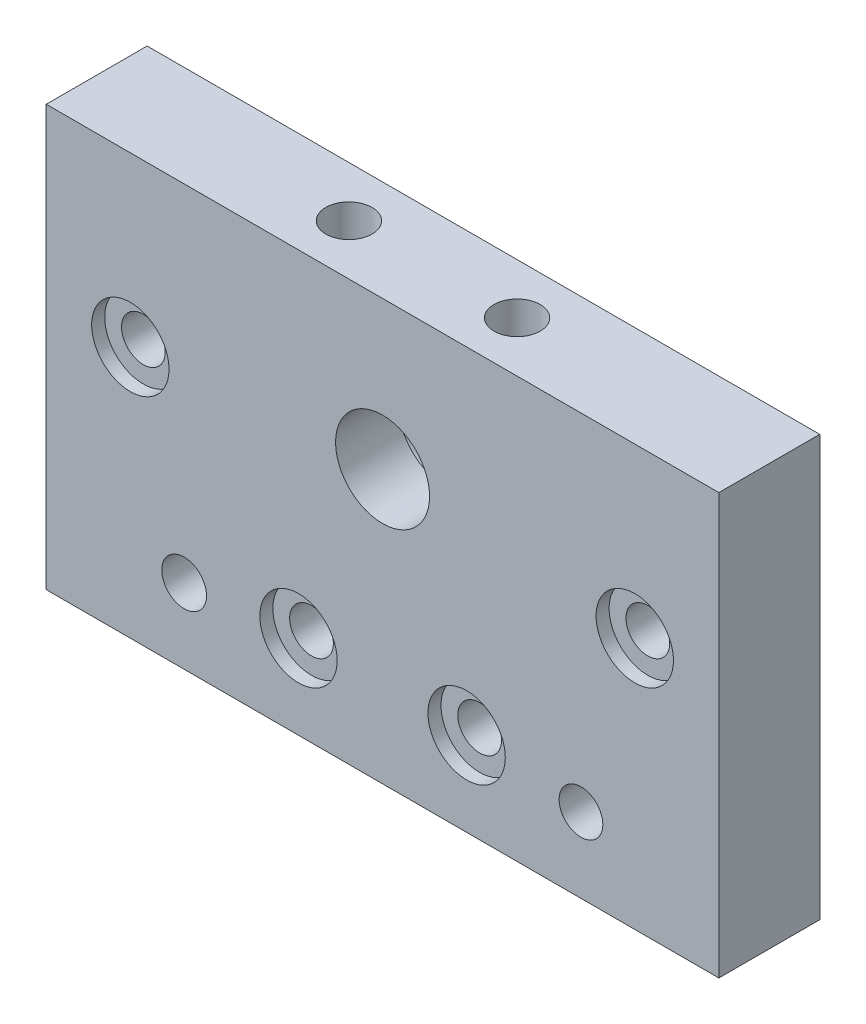
ISO-10303-21;
HEADER;
FILE_DESCRIPTION(('STEP AP214'),'2;1');
FILE_NAME('part.step','',(''),(''),'','','');
FILE_SCHEMA(('AUTOMOTIVE_DESIGN { 1 0 10303 214 1 1 1 1 }'));
ENDSEC;
DATA;
#1=APPLICATION_CONTEXT('core data for automotive mechanical design processes');
#2=APPLICATION_PROTOCOL_DEFINITION('international standard','automotive_design',2000,#1);
#3=PRODUCT_CONTEXT('',#1,'mechanical');
#4=PRODUCT('Part','Part','',(#3));
#5=PRODUCT_RELATED_PRODUCT_CATEGORY('part','',(#4));
#6=PRODUCT_DEFINITION_FORMATION('','',#4);
#7=PRODUCT_DEFINITION_CONTEXT('part definition',#1,'design');
#8=PRODUCT_DEFINITION('design','',#6,#7);
#9=PRODUCT_DEFINITION_SHAPE('','',#8);
#10=(LENGTH_UNIT() NAMED_UNIT(*) SI_UNIT(.MILLI.,.METRE.));
#11=(NAMED_UNIT(*) PLANE_ANGLE_UNIT() SI_UNIT($,.RADIAN.));
#12=(NAMED_UNIT(*) SI_UNIT($,.STERADIAN.) SOLID_ANGLE_UNIT());
#13=UNCERTAINTY_MEASURE_WITH_UNIT(LENGTH_MEASURE(1.E-05),#10,'distance_accuracy_value','');
#14=(GEOMETRIC_REPRESENTATION_CONTEXT(3) GLOBAL_UNCERTAINTY_ASSIGNED_CONTEXT((#13)) GLOBAL_UNIT_ASSIGNED_CONTEXT((#10,
#11,#12)) REPRESENTATION_CONTEXT('',''));
#15=CARTESIAN_POINT('',(0.,0.,0.));
#16=DIRECTION('',(0.,0.,1.));
#17=DIRECTION('',(1.,0.,0.));
#18=AXIS2_PLACEMENT_3D('',#15,#16,#17);
#19=CARTESIAN_POINT('',(40.,32.4,12.));
#20=DIRECTION('',(0.,0.,-1.));
#21=DIRECTION('',(-1.,0.,0.));
#22=AXIS2_PLACEMENT_3D('',#19,#20,#21);
#23=CYLINDRICAL_SURFACE('',#22,5.59);
#24=CARTESIAN_POINT('',(40.,32.4,12.));
#25=DIRECTION('',(0.,0.,1.));
#26=DIRECTION('',(1.,0.,0.));
#27=AXIS2_PLACEMENT_3D('',#24,#25,#26);
#28=CIRCLE('',#27,5.59);
#29=CARTESIAN_POINT('',(45.59,32.4,12.));
#30=VERTEX_POINT('',#29);
#31=EDGE_CURVE('E187',#30,#30,#28,.T.);
#32=ORIENTED_EDGE('',*,*,#31,.T.);
#33=EDGE_LOOP('',(#32));
#34=FACE_BOUND('',#33,.T.);
#35=CARTESIAN_POINT('',(40.,32.4,4.5));
#36=DIRECTION('',(0.,0.,-1.));
#37=DIRECTION('',(-1.,0.,0.));
#38=AXIS2_PLACEMENT_3D('',#35,#36,#37);
#39=CIRCLE('',#38,5.59);
#40=CARTESIAN_POINT('',(34.41,32.4,4.5));
#41=VERTEX_POINT('',#40);
#42=EDGE_CURVE('E44',#41,#41,#39,.T.);
#43=ORIENTED_EDGE('',*,*,#42,.T.);
#44=EDGE_LOOP('',(#43));
#45=FACE_BOUND('',#44,.T.);
#46=ADVANCED_FACE('F40',(#34,#45),#23,.F.);
#47=CARTESIAN_POINT('',(10.,30.,12.));
#48=DIRECTION('',(0.,0.,-1.));
#49=DIRECTION('',(-1.,0.,0.));
#50=AXIS2_PLACEMENT_3D('',#47,#48,#49);
#51=CYLINDRICAL_SURFACE('',#50,2.6);
#52=CARTESIAN_POINT('',(10.,30.,0.));
#53=DIRECTION('',(0.,0.,1.));
#54=DIRECTION('',(1.,0.,0.));
#55=AXIS2_PLACEMENT_3D('',#52,#53,#54);
#56=CIRCLE('',#55,2.6);
#57=CARTESIAN_POINT('',(12.6,30.,0.));
#58=VERTEX_POINT('',#57);
#59=EDGE_CURVE('E198',#58,#58,#56,.T.);
#60=ORIENTED_EDGE('',*,*,#59,.F.);
#61=EDGE_LOOP('',(#60));
#62=FACE_BOUND('',#61,.T.);
#63=CARTESIAN_POINT('',(10.,30.,10.45));
#64=DIRECTION('',(0.,0.,1.));
#65=DIRECTION('',(1.,0.,0.));
#66=AXIS2_PLACEMENT_3D('',#63,#64,#65);
#67=CIRCLE('',#66,2.6);
#68=CARTESIAN_POINT('',(12.6,30.,10.45));
#69=VERTEX_POINT('',#68);
#70=EDGE_CURVE('E174',#69,#69,#67,.T.);
#71=ORIENTED_EDGE('',*,*,#70,.T.);
#72=EDGE_LOOP('',(#71));
#73=FACE_BOUND('',#72,.T.);
#74=ADVANCED_FACE('F244',(#62,#73),#51,.F.);
#75=CARTESIAN_POINT('',(70.,30.,12.));
#76=DIRECTION('',(0.,0.,-1.));
#77=DIRECTION('',(-1.,0.,0.));
#78=AXIS2_PLACEMENT_3D('',#75,#76,#77);
#79=CYLINDRICAL_SURFACE('',#78,2.6);
#80=CARTESIAN_POINT('',(70.,30.,0.));
#81=DIRECTION('',(0.,0.,1.));
#82=DIRECTION('',(1.,0.,0.));
#83=AXIS2_PLACEMENT_3D('',#80,#81,#82);
#84=CIRCLE('',#83,2.6);
#85=CARTESIAN_POINT('',(72.6,30.,0.));
#86=VERTEX_POINT('',#85);
#87=EDGE_CURVE('E194',#86,#86,#84,.T.);
#88=ORIENTED_EDGE('',*,*,#87,.F.);
#89=EDGE_LOOP('',(#88));
#90=FACE_BOUND('',#89,.T.);
#91=CARTESIAN_POINT('',(70.,30.,10.45));
#92=DIRECTION('',(0.,0.,1.));
#93=DIRECTION('',(1.,0.,0.));
#94=AXIS2_PLACEMENT_3D('',#91,#92,#93);
#95=CIRCLE('',#94,2.6);
#96=CARTESIAN_POINT('',(72.6,30.,10.45));
#97=VERTEX_POINT('',#96);
#98=EDGE_CURVE('E237',#97,#97,#95,.T.);
#99=ORIENTED_EDGE('',*,*,#98,.T.);
#100=EDGE_LOOP('',(#99));
#101=FACE_BOUND('',#100,.T.);
#102=ADVANCED_FACE('F305',(#90,#101),#79,.F.);
#103=CARTESIAN_POINT('',(30.,10.,12.));
#104=DIRECTION('',(0.,0.,-1.));
#105=DIRECTION('',(-1.,0.,0.));
#106=AXIS2_PLACEMENT_3D('',#103,#104,#105);
#107=CYLINDRICAL_SURFACE('',#106,2.6);
#108=CARTESIAN_POINT('',(30.,10.,0.));
#109=DIRECTION('',(0.,0.,1.));
#110=DIRECTION('',(1.,0.,0.));
#111=AXIS2_PLACEMENT_3D('',#108,#109,#110);
#112=CIRCLE('',#111,2.6);
#113=CARTESIAN_POINT('',(32.6,10.,0.));
#114=VERTEX_POINT('',#113);
#115=EDGE_CURVE('E178',#114,#114,#112,.T.);
#116=ORIENTED_EDGE('',*,*,#115,.F.);
#117=EDGE_LOOP('',(#116));
#118=FACE_BOUND('',#117,.T.);
#119=CARTESIAN_POINT('',(30.,10.,10.45));
#120=DIRECTION('',(0.,0.,1.));
#121=DIRECTION('',(1.,0.,0.));
#122=AXIS2_PLACEMENT_3D('',#119,#120,#121);
#123=CIRCLE('',#122,2.6);
#124=CARTESIAN_POINT('',(32.6,10.,10.45));
#125=VERTEX_POINT('',#124);
#126=EDGE_CURVE('E233',#125,#125,#123,.T.);
#127=ORIENTED_EDGE('',*,*,#126,.T.);
#128=EDGE_LOOP('',(#127));
#129=FACE_BOUND('',#128,.T.);
#130=ADVANCED_FACE('F313',(#118,#129),#107,.F.);
#131=CARTESIAN_POINT('',(50.,10.,12.));
#132=DIRECTION('',(0.,0.,-1.));
#133=DIRECTION('',(-1.,0.,0.));
#134=AXIS2_PLACEMENT_3D('',#131,#132,#133);
#135=CYLINDRICAL_SURFACE('',#134,2.6);
#136=CARTESIAN_POINT('',(50.,10.,0.));
#137=DIRECTION('',(0.,0.,1.));
#138=DIRECTION('',(1.,0.,0.));
#139=AXIS2_PLACEMENT_3D('',#136,#137,#138);
#140=CIRCLE('',#139,2.6);
#141=CARTESIAN_POINT('',(52.6,10.,0.));
#142=VERTEX_POINT('',#141);
#143=EDGE_CURVE('E169',#142,#142,#140,.T.);
#144=ORIENTED_EDGE('',*,*,#143,.F.);
#145=EDGE_LOOP('',(#144));
#146=FACE_BOUND('',#145,.T.);
#147=CARTESIAN_POINT('',(50.,10.,10.45));
#148=DIRECTION('',(0.,0.,1.));
#149=DIRECTION('',(1.,0.,0.));
#150=AXIS2_PLACEMENT_3D('',#147,#148,#149);
#151=CIRCLE('',#150,2.6);
#152=CARTESIAN_POINT('',(52.6,10.,10.45));
#153=VERTEX_POINT('',#152);
#154=EDGE_CURVE('E136',#153,#153,#151,.T.);
#155=ORIENTED_EDGE('',*,*,#154,.T.);
#156=EDGE_LOOP('',(#155));
#157=FACE_BOUND('',#156,.T.);
#158=ADVANCED_FACE('F264',(#146,#157),#135,.F.);
#159=CARTESIAN_POINT('',(0.,0.,12.));
#160=DIRECTION('',(0.,0.,-1.));
#161=DIRECTION('',(-1.,0.,0.));
#162=AXIS2_PLACEMENT_3D('',#159,#160,#161);
#163=PLANE('',#162);
#164=CARTESIAN_POINT('',(10.,30.,12.));
#165=DIRECTION('',(0.,0.,1.));
#166=DIRECTION('',(1.,0.,0.));
#167=AXIS2_PLACEMENT_3D('',#164,#165,#166);
#168=CIRCLE('',#167,4.6);
#169=CARTESIAN_POINT('',(14.6,30.,12.));
#170=VERTEX_POINT('',#169);
#171=EDGE_CURVE('E137',#170,#170,#168,.T.);
#172=ORIENTED_EDGE('',*,*,#171,.F.);
#173=EDGE_LOOP('',(#172));
#174=FACE_BOUND('',#173,.T.);
#175=CARTESIAN_POINT('',(50.,10.,12.));
#176=DIRECTION('',(0.,0.,1.));
#177=DIRECTION('',(1.,0.,0.));
#178=AXIS2_PLACEMENT_3D('',#175,#176,#177);
#179=CIRCLE('',#178,4.6);
#180=CARTESIAN_POINT('',(54.6,10.,12.));
#181=VERTEX_POINT('',#180);
#182=EDGE_CURVE('E147',#181,#181,#179,.T.);
#183=ORIENTED_EDGE('',*,*,#182,.F.);
#184=EDGE_LOOP('',(#183));
#185=FACE_BOUND('',#184,.T.);
#186=CARTESIAN_POINT('',(30.,10.,12.));
#187=DIRECTION('',(0.,0.,1.));
#188=DIRECTION('',(1.,0.,0.));
#189=AXIS2_PLACEMENT_3D('',#186,#187,#188);
#190=CIRCLE('',#189,4.6);
#191=CARTESIAN_POINT('',(34.6,10.,12.));
#192=VERTEX_POINT('',#191);
#193=EDGE_CURVE('E146',#192,#192,#190,.T.);
#194=ORIENTED_EDGE('',*,*,#193,.F.);
#195=EDGE_LOOP('',(#194));
#196=FACE_BOUND('',#195,.T.);
#197=CARTESIAN_POINT('',(70.,30.,12.));
#198=DIRECTION('',(0.,0.,1.));
#199=DIRECTION('',(1.,0.,0.));
#200=AXIS2_PLACEMENT_3D('',#197,#198,#199);
#201=CIRCLE('',#200,4.6);
#202=CARTESIAN_POINT('',(74.6,30.,12.));
#203=VERTEX_POINT('',#202);
#204=EDGE_CURVE('E154',#203,#203,#201,.T.);
#205=ORIENTED_EDGE('',*,*,#204,.F.);
#206=EDGE_LOOP('',(#205));
#207=FACE_BOUND('',#206,.T.);
#208=DIRECTION('',(0.,-1.,0.));
#209=VECTOR('',#208,1.);
#210=CARTESIAN_POINT('',(0.,0.,12.));
#211=LINE('',#210,#209);
#212=CARTESIAN_POINT('',(0.,50.,12.));
#213=VERTEX_POINT('',#212);
#214=CARTESIAN_POINT('',(0.,0.,12.));
#215=VERTEX_POINT('',#214);
#216=EDGE_CURVE('E203',#213,#215,#211,.T.);
#217=ORIENTED_EDGE('',*,*,#216,.T.);
#218=DIRECTION('',(1.,0.,0.));
#219=VECTOR('',#218,1.);
#220=CARTESIAN_POINT('',(0.,0.,12.));
#221=LINE('',#220,#219);
#222=CARTESIAN_POINT('',(80.,0.,12.));
#223=VERTEX_POINT('',#222);
#224=EDGE_CURVE('E91',#215,#223,#221,.T.);
#225=ORIENTED_EDGE('',*,*,#224,.T.);
#226=DIRECTION('',(0.,1.,0.));
#227=VECTOR('',#226,1.);
#228=CARTESIAN_POINT('',(80.,50.,12.));
#229=LINE('',#228,#227);
#230=CARTESIAN_POINT('',(80.,50.,12.));
#231=VERTEX_POINT('',#230);
#232=EDGE_CURVE('E208',#223,#231,#229,.T.);
#233=ORIENTED_EDGE('',*,*,#232,.T.);
#234=DIRECTION('',(-1.,0.,0.));
#235=VECTOR('',#234,1.);
#236=CARTESIAN_POINT('',(0.,50.,12.));
#237=LINE('',#236,#235);
#238=EDGE_CURVE('E60',#231,#213,#237,.T.);
#239=ORIENTED_EDGE('',*,*,#238,.T.);
#240=EDGE_LOOP('',(#217,#225,#233,#239));
#241=FACE_BOUND('',#240,.T.);
#242=ORIENTED_EDGE('',*,*,#31,.F.);
#243=EDGE_LOOP('',(#242));
#244=FACE_BOUND('',#243,.T.);
#245=CARTESIAN_POINT('',(16.4,8.9,12.));
#246=DIRECTION('',(0.,0.,1.));
#247=DIRECTION('',(1.,0.,0.));
#248=AXIS2_PLACEMENT_3D('',#245,#246,#247);
#249=CIRCLE('',#248,2.66170371125502);
#250=CARTESIAN_POINT('',(19.061703711255,8.9,12.));
#251=VERTEX_POINT('',#250);
#252=EDGE_CURVE('E183',#251,#251,#249,.T.);
#253=ORIENTED_EDGE('',*,*,#252,.F.);
#254=EDGE_LOOP('',(#253));
#255=FACE_BOUND('',#254,.T.);
#256=CARTESIAN_POINT('',(63.6,8.9,12.));
#257=DIRECTION('',(0.,0.,1.));
#258=DIRECTION('',(1.,0.,0.));
#259=AXIS2_PLACEMENT_3D('',#256,#257,#258);
#260=CIRCLE('',#259,2.6);
#261=CARTESIAN_POINT('',(66.2,8.9,12.));
#262=VERTEX_POINT('',#261);
#263=EDGE_CURVE('E165',#262,#262,#260,.T.);
#264=ORIENTED_EDGE('',*,*,#263,.F.);
#265=EDGE_LOOP('',(#264));
#266=FACE_BOUND('',#265,.T.);
#267=ADVANCED_FACE('F260',(#174,#185,#196,#207,#241,#244,#255,#266),#163,.F.);
#268=CARTESIAN_POINT('',(0.,0.,0.));
#269=DIRECTION('',(0.,0.,-1.));
#270=DIRECTION('',(-1.,0.,0.));
#271=AXIS2_PLACEMENT_3D('',#268,#269,#270);
#272=PLANE('',#271);
#273=CARTESIAN_POINT('',(40.,32.4,0.));
#274=DIRECTION('',(0.,0.,-1.));
#275=DIRECTION('',(-1.,0.,0.));
#276=AXIS2_PLACEMENT_3D('',#273,#274,#275);
#277=CIRCLE('',#276,8.05);
#278=CARTESIAN_POINT('',(31.95,32.4,0.));
#279=VERTEX_POINT('',#278);
#280=EDGE_CURVE('E124',#279,#279,#277,.T.);
#281=ORIENTED_EDGE('',*,*,#280,.F.);
#282=EDGE_LOOP('',(#281));
#283=FACE_BOUND('',#282,.T.);
#284=ORIENTED_EDGE('',*,*,#143,.T.);
#285=EDGE_LOOP('',(#284));
#286=FACE_BOUND('',#285,.T.);
#287=CARTESIAN_POINT('',(16.4,8.9,0.));
#288=DIRECTION('',(0.,0.,1.));
#289=DIRECTION('',(1.,0.,0.));
#290=AXIS2_PLACEMENT_3D('',#287,#288,#289);
#291=CIRCLE('',#290,2.66170371125502);
#292=CARTESIAN_POINT('',(19.061703711255,8.9,0.));
#293=VERTEX_POINT('',#292);
#294=EDGE_CURVE('E182',#293,#293,#291,.T.);
#295=ORIENTED_EDGE('',*,*,#294,.T.);
#296=EDGE_LOOP('',(#295));
#297=FACE_BOUND('',#296,.T.);
#298=ORIENTED_EDGE('',*,*,#87,.T.);
#299=EDGE_LOOP('',(#298));
#300=FACE_BOUND('',#299,.T.);
#301=DIRECTION('',(0.,-1.,0.));
#302=VECTOR('',#301,1.);
#303=CARTESIAN_POINT('',(0.,0.,0.));
#304=LINE('',#303,#302);
#305=CARTESIAN_POINT('',(0.,50.,0.));
#306=VERTEX_POINT('',#305);
#307=CARTESIAN_POINT('',(0.,0.,0.));
#308=VERTEX_POINT('',#307);
#309=EDGE_CURVE('E202',#306,#308,#304,.T.);
#310=ORIENTED_EDGE('',*,*,#309,.F.);
#311=DIRECTION('',(-1.,0.,0.));
#312=VECTOR('',#311,1.);
#313=CARTESIAN_POINT('',(0.,50.,0.));
#314=LINE('',#313,#312);
#315=CARTESIAN_POINT('',(80.,50.,0.));
#316=VERTEX_POINT('',#315);
#317=EDGE_CURVE('E84',#316,#306,#314,.T.);
#318=ORIENTED_EDGE('',*,*,#317,.F.);
#319=DIRECTION('',(0.,1.,0.));
#320=VECTOR('',#319,1.);
#321=CARTESIAN_POINT('',(80.,50.,0.));
#322=LINE('',#321,#320);
#323=CARTESIAN_POINT('',(80.,0.,0.));
#324=VERTEX_POINT('',#323);
#325=EDGE_CURVE('E78',#324,#316,#322,.T.);
#326=ORIENTED_EDGE('',*,*,#325,.F.);
#327=DIRECTION('',(1.,0.,0.));
#328=VECTOR('',#327,1.);
#329=CARTESIAN_POINT('',(0.,0.,0.));
#330=LINE('',#329,#328);
#331=EDGE_CURVE('E217',#308,#324,#330,.T.);
#332=ORIENTED_EDGE('',*,*,#331,.F.);
#333=EDGE_LOOP('',(#310,#318,#326,#332));
#334=FACE_BOUND('',#333,.T.);
#335=ORIENTED_EDGE('',*,*,#59,.T.);
#336=EDGE_LOOP('',(#335));
#337=FACE_BOUND('',#336,.T.);
#338=ORIENTED_EDGE('',*,*,#115,.T.);
#339=EDGE_LOOP('',(#338));
#340=FACE_BOUND('',#339,.T.);
#341=CARTESIAN_POINT('',(63.6,8.9,0.));
#342=DIRECTION('',(0.,0.,1.));
#343=DIRECTION('',(1.,0.,0.));
#344=AXIS2_PLACEMENT_3D('',#341,#342,#343);
#345=CIRCLE('',#344,2.6);
#346=CARTESIAN_POINT('',(66.2,8.9,0.));
#347=VERTEX_POINT('',#346);
#348=EDGE_CURVE('E170',#347,#347,#345,.T.);
#349=ORIENTED_EDGE('',*,*,#348,.T.);
#350=EDGE_LOOP('',(#349));
#351=FACE_BOUND('',#350,.T.);
#352=ADVANCED_FACE('F263',(#283,#286,#297,#300,#334,#337,#340,#351),#272,.T.);
#353=CARTESIAN_POINT('',(0.,0.,12.));
#354=DIRECTION('',(1.,0.,0.));
#355=DIRECTION('',(0.,0.,-1.));
#356=AXIS2_PLACEMENT_3D('',#353,#354,#355);
#357=PLANE('',#356);
#358=ORIENTED_EDGE('',*,*,#309,.T.);
#359=DIRECTION('',(0.,0.,-1.));
#360=VECTOR('',#359,1.);
#361=CARTESIAN_POINT('',(0.,0.,12.));
#362=LINE('',#361,#360);
#363=EDGE_CURVE('E11',#215,#308,#362,.T.);
#364=ORIENTED_EDGE('',*,*,#363,.F.);
#365=ORIENTED_EDGE('',*,*,#216,.F.);
#366=DIRECTION('',(0.,0.,-1.));
#367=VECTOR('',#366,1.);
#368=CARTESIAN_POINT('',(0.,50.,12.));
#369=LINE('',#368,#367);
#370=EDGE_CURVE('E213',#213,#306,#369,.T.);
#371=ORIENTED_EDGE('',*,*,#370,.T.);
#372=EDGE_LOOP('',(#358,#364,#365,#371));
#373=FACE_BOUND('',#372,.T.);
#374=ADVANCED_FACE('F42',(#373),#357,.F.);
#375=CARTESIAN_POINT('',(0.,0.,12.));
#376=DIRECTION('',(0.,1.,0.));
#377=DIRECTION('',(0.,0.,1.));
#378=AXIS2_PLACEMENT_3D('',#375,#376,#377);
#379=PLANE('',#378);
#380=ORIENTED_EDGE('',*,*,#331,.T.);
#381=DIRECTION('',(0.,0.,-1.));
#382=VECTOR('',#381,1.);
#383=CARTESIAN_POINT('',(80.,0.,12.));
#384=LINE('',#383,#382);
#385=EDGE_CURVE('E51',#223,#324,#384,.T.);
#386=ORIENTED_EDGE('',*,*,#385,.F.);
#387=ORIENTED_EDGE('',*,*,#224,.F.);
#388=ORIENTED_EDGE('',*,*,#363,.T.);
#389=EDGE_LOOP('',(#380,#386,#387,#388));
#390=FACE_BOUND('',#389,.T.);
#391=ADVANCED_FACE('F294',(#390),#379,.F.);
#392=CARTESIAN_POINT('',(80.,50.,12.));
#393=DIRECTION('',(-1.,0.,0.));
#394=DIRECTION('',(0.,0.,1.));
#395=AXIS2_PLACEMENT_3D('',#392,#393,#394);
#396=PLANE('',#395);
#397=ORIENTED_EDGE('',*,*,#325,.T.);
#398=DIRECTION('',(0.,0.,-1.));
#399=VECTOR('',#398,1.);
#400=CARTESIAN_POINT('',(80.,50.,12.));
#401=LINE('',#400,#399);
#402=EDGE_CURVE('E226',#231,#316,#401,.T.);
#403=ORIENTED_EDGE('',*,*,#402,.F.);
#404=ORIENTED_EDGE('',*,*,#232,.F.);
#405=ORIENTED_EDGE('',*,*,#385,.T.);
#406=EDGE_LOOP('',(#397,#403,#404,#405));
#407=FACE_BOUND('',#406,.T.);
#408=ADVANCED_FACE('F386',(#407),#396,.F.);
#409=CARTESIAN_POINT('',(0.,50.,12.));
#410=DIRECTION('',(0.,-1.,0.));
#411=DIRECTION('',(0.,0.,-1.));
#412=AXIS2_PLACEMENT_3D('',#409,#410,#411);
#413=PLANE('',#412);
#414=CARTESIAN_POINT('',(50.,50.,6.));
#415=DIRECTION('',(0.,1.,0.));
#416=DIRECTION('',(0.,0.,1.));
#417=AXIS2_PLACEMENT_3D('',#414,#415,#416);
#418=CIRCLE('',#417,2.75);
#419=CARTESIAN_POINT('',(50.,50.,8.75));
#420=VERTEX_POINT('',#419);
#421=EDGE_CURVE('E110',#420,#420,#418,.T.);
#422=ORIENTED_EDGE('',*,*,#421,.F.);
#423=EDGE_LOOP('',(#422));
#424=FACE_BOUND('',#423,.T.);
#425=CARTESIAN_POINT('',(30.,50.,6.));
#426=DIRECTION('',(0.,1.,0.));
#427=DIRECTION('',(0.,0.,1.));
#428=AXIS2_PLACEMENT_3D('',#425,#426,#427);
#429=CIRCLE('',#428,2.74999999999999);
#430=CARTESIAN_POINT('',(30.,50.,8.74999999999999));
#431=VERTEX_POINT('',#430);
#432=EDGE_CURVE('E109',#431,#431,#429,.T.);
#433=ORIENTED_EDGE('',*,*,#432,.F.);
#434=EDGE_LOOP('',(#433));
#435=FACE_BOUND('',#434,.T.);
#436=ORIENTED_EDGE('',*,*,#317,.T.);
#437=ORIENTED_EDGE('',*,*,#370,.F.);
#438=ORIENTED_EDGE('',*,*,#238,.F.);
#439=ORIENTED_EDGE('',*,*,#402,.T.);
#440=EDGE_LOOP('',(#436,#437,#438,#439));
#441=FACE_BOUND('',#440,.T.);
#442=ADVANCED_FACE('F383',(#424,#435,#441),#413,.F.);
#443=CARTESIAN_POINT('',(16.4,8.9,12.));
#444=DIRECTION('',(0.,0.,-1.));
#445=DIRECTION('',(-1.,0.,0.));
#446=AXIS2_PLACEMENT_3D('',#443,#444,#445);
#447=CYLINDRICAL_SURFACE('',#446,2.66170371125502);
#448=ORIENTED_EDGE('',*,*,#252,.T.);
#449=EDGE_LOOP('',(#448));
#450=FACE_BOUND('',#449,.T.);
#451=ORIENTED_EDGE('',*,*,#294,.F.);
#452=EDGE_LOOP('',(#451));
#453=FACE_BOUND('',#452,.T.);
#454=ADVANCED_FACE('F284',(#450,#453),#447,.F.);
#455=CARTESIAN_POINT('',(63.6,8.9,12.));
#456=DIRECTION('',(0.,0.,-1.));
#457=DIRECTION('',(-1.,0.,0.));
#458=AXIS2_PLACEMENT_3D('',#455,#456,#457);
#459=CYLINDRICAL_SURFACE('',#458,2.6);
#460=ORIENTED_EDGE('',*,*,#263,.T.);
#461=EDGE_LOOP('',(#460));
#462=FACE_BOUND('',#461,.T.);
#463=ORIENTED_EDGE('',*,*,#348,.F.);
#464=EDGE_LOOP('',(#463));
#465=FACE_BOUND('',#464,.T.);
#466=ADVANCED_FACE('F280',(#462,#465),#459,.F.);
#467=CARTESIAN_POINT('',(50.,10.,10.45));
#468=DIRECTION('',(0.,0.,1.));
#469=DIRECTION('',(1.,0.,0.));
#470=AXIS2_PLACEMENT_3D('',#467,#468,#469);
#471=CYLINDRICAL_SURFACE('',#470,4.6);
#472=CARTESIAN_POINT('',(50.,10.,10.45));
#473=DIRECTION('',(0.,0.,1.));
#474=DIRECTION('',(1.,0.,0.));
#475=AXIS2_PLACEMENT_3D('',#472,#473,#474);
#476=CIRCLE('',#475,4.6);
#477=CARTESIAN_POINT('',(54.6,10.,10.45));
#478=VERTEX_POINT('',#477);
#479=EDGE_CURVE('E142',#478,#478,#476,.T.);
#480=CARTESIAN_POINT('',(54.6,10.,10.45));
#481=CARTESIAN_POINT('',(54.6,10.,10.4661458333333));
#482=CARTESIAN_POINT('',(54.6,10.,10.4822916666667));
#483=CARTESIAN_POINT('',(54.6,10.,10.5145833333333));
#484=CARTESIAN_POINT('',(54.6,10.,10.5307291666667));
#485=CARTESIAN_POINT('',(54.6,10.,10.5630208333333));
#486=CARTESIAN_POINT('',(54.6,10.,10.5791666666667));
#487=CARTESIAN_POINT('',(54.6,10.,10.6114583333333));
#488=CARTESIAN_POINT('',(54.6,10.,10.6276041666667));
#489=CARTESIAN_POINT('',(54.6,10.,10.6598958333333));
#490=CARTESIAN_POINT('',(54.6,10.,10.6760416666667));
#491=CARTESIAN_POINT('',(54.6,10.,10.7083333333333));
#492=CARTESIAN_POINT('',(54.6,10.,10.7244791666667));
#493=CARTESIAN_POINT('',(54.6,10.,10.7567708333333));
#494=CARTESIAN_POINT('',(54.6,10.,10.7729166666667));
#495=CARTESIAN_POINT('',(54.6,10.,10.8052083333333));
#496=CARTESIAN_POINT('',(54.6,10.,10.8213541666667));
#497=CARTESIAN_POINT('',(54.6,10.,10.8536458333333));
#498=CARTESIAN_POINT('',(54.6,10.,10.8697916666667));
#499=CARTESIAN_POINT('',(54.6,10.,10.9020833333333));
#500=CARTESIAN_POINT('',(54.6,10.,10.9182291666667));
#501=CARTESIAN_POINT('',(54.6,10.,10.9505208333333));
#502=CARTESIAN_POINT('',(54.6,10.,10.9666666666667));
#503=CARTESIAN_POINT('',(54.6,10.,10.9989583333333));
#504=CARTESIAN_POINT('',(54.6,10.,11.0151041666667));
#505=CARTESIAN_POINT('',(54.6,10.,11.0473958333333));
#506=CARTESIAN_POINT('',(54.6,10.,11.0635416666667));
#507=CARTESIAN_POINT('',(54.6,10.,11.0958333333333));
#508=CARTESIAN_POINT('',(54.6,10.,11.1119791666667));
#509=CARTESIAN_POINT('',(54.6,10.,11.1442708333333));
#510=CARTESIAN_POINT('',(54.6,10.,11.1604166666667));
#511=CARTESIAN_POINT('',(54.6,10.,11.1927083333333));
#512=CARTESIAN_POINT('',(54.6,10.,11.2088541666667));
#513=CARTESIAN_POINT('',(54.6,10.,11.2411458333333));
#514=CARTESIAN_POINT('',(54.6,10.,11.2572916666667));
#515=CARTESIAN_POINT('',(54.6,10.,11.2895833333333));
#516=CARTESIAN_POINT('',(54.6,10.,11.3057291666667));
#517=CARTESIAN_POINT('',(54.6,10.,11.3380208333333));
#518=CARTESIAN_POINT('',(54.6,10.,11.3541666666667));
#519=CARTESIAN_POINT('',(54.6,10.,11.3864583333333));
#520=CARTESIAN_POINT('',(54.6,10.,11.4026041666667));
#521=CARTESIAN_POINT('',(54.6,10.,11.4348958333333));
#522=CARTESIAN_POINT('',(54.6,10.,11.4510416666667));
#523=CARTESIAN_POINT('',(54.6,10.,11.4833333333333));
#524=CARTESIAN_POINT('',(54.6,10.,11.4994791666667));
#525=CARTESIAN_POINT('',(54.6,10.,11.5317708333333));
#526=CARTESIAN_POINT('',(54.6,10.,11.5479166666667));
#527=CARTESIAN_POINT('',(54.6,10.,11.5802083333333));
#528=CARTESIAN_POINT('',(54.6,10.,11.5963541666667));
#529=CARTESIAN_POINT('',(54.6,10.,11.6286458333333));
#530=CARTESIAN_POINT('',(54.6,10.,11.6447916666667));
#531=CARTESIAN_POINT('',(54.6,10.,11.6770833333333));
#532=CARTESIAN_POINT('',(54.6,10.,11.6932291666667));
#533=CARTESIAN_POINT('',(54.6,10.,11.7255208333333));
#534=CARTESIAN_POINT('',(54.6,10.,11.7416666666667));
#535=CARTESIAN_POINT('',(54.6,10.,11.7739583333333));
#536=CARTESIAN_POINT('',(54.6,10.,11.7901041666667));
#537=CARTESIAN_POINT('',(54.6,10.,11.8223958333333));
#538=CARTESIAN_POINT('',(54.6,10.,11.8385416666667));
#539=CARTESIAN_POINT('',(54.6,10.,11.8708333333333));
#540=CARTESIAN_POINT('',(54.6,10.,11.8869791666667));
#541=CARTESIAN_POINT('',(54.6,10.,11.9192708333333));
#542=CARTESIAN_POINT('',(54.6,10.,11.9354166666667));
#543=CARTESIAN_POINT('',(54.6,10.,11.9677083333333));
#544=CARTESIAN_POINT('',(54.6,10.,11.9838541666667));
#545=CARTESIAN_POINT('',(54.6,10.,12.));
#546=B_SPLINE_CURVE_WITH_KNOTS('',3,(#480,#481,#482,#483,#484,#485,#486,#487,#488,#489,#490,
#491,#492,#493,#494,#495,#496,#497,#498,#499,#500,#501,#502,#503,#504,#505,#506,#507,#508,#509,
#510,#511,#512,#513,#514,#515,#516,#517,#518,#519,#520,#521,#522,#523,#524,#525,#526,#527,#528,
#529,#530,#531,#532,#533,#534,#535,#536,#537,#538,#539,#540,#541,#542,#543,#544,#545),
.UNSPECIFIED.,.F.,.F.,(4,2,2,2,2,2,2,2,2,2,2,2,2,2,2,2,2,2,2,2,2,2,2,2,2,2,2,2,2,2,2,2,4),(0.,
0.0484374999999999,0.0968749999999997,0.1453125,0.193749999999999,0.242187499999999,
0.290624999999999,0.339062499999999,0.387499999999999,0.435937499999999,0.484374999999999,
0.532812499999999,0.581249999999998,0.629687499999998,0.678124999999998,0.726562499999998,
0.774999999999998,0.823437499999999,0.871874999999999,0.920312499999999,0.968749999999999,
1.0171875,1.065625,1.1140625,1.1625,1.2109375,1.259375,1.3078125,1.35625,1.4046875,1.453125,
1.5015625,1.55),.UNSPECIFIED.);
#547=EDGE_CURVE('BSEAM283',#478,#181,#546,.T.);
#548=ORIENTED_EDGE('',*,*,#479,.F.);
#549=ORIENTED_EDGE('',*,*,#182,.T.);
#550=ORIENTED_EDGE('',*,*,#547,.T.);
#551=ORIENTED_EDGE('',*,*,#547,.F.);
#552=EDGE_LOOP('',(#548,#550,#549,#551));
#553=FACE_BOUND('',#552,.T.);
#554=ADVANCED_FACE('F283',(#553),#471,.F.);
#555=CARTESIAN_POINT('',(50.,10.,10.45));
#556=DIRECTION('',(0.,0.,1.));
#557=DIRECTION('',(1.,0.,0.));
#558=AXIS2_PLACEMENT_3D('',#555,#556,#557);
#559=PLANE('',#558);
#560=ORIENTED_EDGE('',*,*,#154,.F.);
#561=EDGE_LOOP('',(#560));
#562=FACE_BOUND('',#561,.T.);
#563=ORIENTED_EDGE('',*,*,#479,.T.);
#564=EDGE_LOOP('',(#563));
#565=FACE_BOUND('',#564,.T.);
#566=ADVANCED_FACE('F342',(#562,#565),#559,.T.);
#567=CARTESIAN_POINT('',(30.,10.,10.45));
#568=DIRECTION('',(0.,0.,1.));
#569=DIRECTION('',(1.,0.,0.));
#570=AXIS2_PLACEMENT_3D('',#567,#568,#569);
#571=CYLINDRICAL_SURFACE('',#570,4.6);
#572=CARTESIAN_POINT('',(30.,10.,10.45));
#573=DIRECTION('',(0.,0.,1.));
#574=DIRECTION('',(1.,0.,0.));
#575=AXIS2_PLACEMENT_3D('',#572,#573,#574);
#576=CIRCLE('',#575,4.6);
#577=CARTESIAN_POINT('',(34.6,10.,10.45));
#578=VERTEX_POINT('',#577);
#579=EDGE_CURVE('E158',#578,#578,#576,.T.);
#580=CARTESIAN_POINT('',(34.6,10.,10.45));
#581=CARTESIAN_POINT('',(34.6,10.,10.4661458333333));
#582=CARTESIAN_POINT('',(34.6,10.,10.4822916666667));
#583=CARTESIAN_POINT('',(34.6,10.,10.5145833333333));
#584=CARTESIAN_POINT('',(34.6,10.,10.5307291666667));
#585=CARTESIAN_POINT('',(34.6,10.,10.5630208333333));
#586=CARTESIAN_POINT('',(34.6,10.,10.5791666666667));
#587=CARTESIAN_POINT('',(34.6,10.,10.6114583333333));
#588=CARTESIAN_POINT('',(34.6,10.,10.6276041666667));
#589=CARTESIAN_POINT('',(34.6,10.,10.6598958333333));
#590=CARTESIAN_POINT('',(34.6,10.,10.6760416666667));
#591=CARTESIAN_POINT('',(34.6,10.,10.7083333333333));
#592=CARTESIAN_POINT('',(34.6,10.,10.7244791666667));
#593=CARTESIAN_POINT('',(34.6,10.,10.7567708333333));
#594=CARTESIAN_POINT('',(34.6,10.,10.7729166666667));
#595=CARTESIAN_POINT('',(34.6,10.,10.8052083333333));
#596=CARTESIAN_POINT('',(34.6,10.,10.8213541666667));
#597=CARTESIAN_POINT('',(34.6,10.,10.8536458333333));
#598=CARTESIAN_POINT('',(34.6,10.,10.8697916666667));
#599=CARTESIAN_POINT('',(34.6,10.,10.9020833333333));
#600=CARTESIAN_POINT('',(34.6,10.,10.9182291666667));
#601=CARTESIAN_POINT('',(34.6,10.,10.9505208333333));
#602=CARTESIAN_POINT('',(34.6,10.,10.9666666666667));
#603=CARTESIAN_POINT('',(34.6,10.,10.9989583333333));
#604=CARTESIAN_POINT('',(34.6,10.,11.0151041666667));
#605=CARTESIAN_POINT('',(34.6,10.,11.0473958333333));
#606=CARTESIAN_POINT('',(34.6,10.,11.0635416666667));
#607=CARTESIAN_POINT('',(34.6,10.,11.0958333333333));
#608=CARTESIAN_POINT('',(34.6,10.,11.1119791666667));
#609=CARTESIAN_POINT('',(34.6,10.,11.1442708333333));
#610=CARTESIAN_POINT('',(34.6,10.,11.1604166666667));
#611=CARTESIAN_POINT('',(34.6,10.,11.1927083333333));
#612=CARTESIAN_POINT('',(34.6,10.,11.2088541666667));
#613=CARTESIAN_POINT('',(34.6,10.,11.2411458333333));
#614=CARTESIAN_POINT('',(34.6,10.,11.2572916666667));
#615=CARTESIAN_POINT('',(34.6,10.,11.2895833333333));
#616=CARTESIAN_POINT('',(34.6,10.,11.3057291666667));
#617=CARTESIAN_POINT('',(34.6,10.,11.3380208333333));
#618=CARTESIAN_POINT('',(34.6,10.,11.3541666666667));
#619=CARTESIAN_POINT('',(34.6,10.,11.3864583333333));
#620=CARTESIAN_POINT('',(34.6,10.,11.4026041666667));
#621=CARTESIAN_POINT('',(34.6,10.,11.4348958333333));
#622=CARTESIAN_POINT('',(34.6,10.,11.4510416666667));
#623=CARTESIAN_POINT('',(34.6,10.,11.4833333333333));
#624=CARTESIAN_POINT('',(34.6,10.,11.4994791666667));
#625=CARTESIAN_POINT('',(34.6,10.,11.5317708333333));
#626=CARTESIAN_POINT('',(34.6,10.,11.5479166666667));
#627=CARTESIAN_POINT('',(34.6,10.,11.5802083333333));
#628=CARTESIAN_POINT('',(34.6,10.,11.5963541666667));
#629=CARTESIAN_POINT('',(34.6,10.,11.6286458333333));
#630=CARTESIAN_POINT('',(34.6,10.,11.6447916666667));
#631=CARTESIAN_POINT('',(34.6,10.,11.6770833333333));
#632=CARTESIAN_POINT('',(34.6,10.,11.6932291666667));
#633=CARTESIAN_POINT('',(34.6,10.,11.7255208333333));
#634=CARTESIAN_POINT('',(34.6,10.,11.7416666666667));
#635=CARTESIAN_POINT('',(34.6,10.,11.7739583333333));
#636=CARTESIAN_POINT('',(34.6,10.,11.7901041666667));
#637=CARTESIAN_POINT('',(34.6,10.,11.8223958333333));
#638=CARTESIAN_POINT('',(34.6,10.,11.8385416666667));
#639=CARTESIAN_POINT('',(34.6,10.,11.8708333333333));
#640=CARTESIAN_POINT('',(34.6,10.,11.8869791666667));
#641=CARTESIAN_POINT('',(34.6,10.,11.9192708333333));
#642=CARTESIAN_POINT('',(34.6,10.,11.9354166666667));
#643=CARTESIAN_POINT('',(34.6,10.,11.9677083333333));
#644=CARTESIAN_POINT('',(34.6,10.,11.9838541666667));
#645=CARTESIAN_POINT('',(34.6,10.,12.));
#646=B_SPLINE_CURVE_WITH_KNOTS('',3,(#580,#581,#582,#583,#584,#585,#586,#587,#588,#589,#590,
#591,#592,#593,#594,#595,#596,#597,#598,#599,#600,#601,#602,#603,#604,#605,#606,#607,#608,#609,
#610,#611,#612,#613,#614,#615,#616,#617,#618,#619,#620,#621,#622,#623,#624,#625,#626,#627,#628,
#629,#630,#631,#632,#633,#634,#635,#636,#637,#638,#639,#640,#641,#642,#643,#644,#645),
.UNSPECIFIED.,.F.,.F.,(4,2,2,2,2,2,2,2,2,2,2,2,2,2,2,2,2,2,2,2,2,2,2,2,2,2,2,2,2,2,2,2,4),(0.,
0.0484374999999999,0.0968749999999997,0.1453125,0.193749999999999,0.242187499999999,
0.290624999999999,0.339062499999999,0.387499999999999,0.435937499999999,0.484374999999999,
0.532812499999999,0.581249999999998,0.629687499999998,0.678124999999998,0.726562499999998,
0.774999999999998,0.823437499999999,0.871874999999999,0.920312499999999,0.968749999999999,
1.0171875,1.065625,1.1140625,1.1625,1.2109375,1.259375,1.3078125,1.35625,1.4046875,1.453125,
1.5015625,1.55),.UNSPECIFIED.);
#647=EDGE_CURVE('BSEAM336',#578,#192,#646,.T.);
#648=ORIENTED_EDGE('',*,*,#579,.F.);
#649=ORIENTED_EDGE('',*,*,#193,.T.);
#650=ORIENTED_EDGE('',*,*,#647,.T.);
#651=ORIENTED_EDGE('',*,*,#647,.F.);
#652=EDGE_LOOP('',(#648,#650,#649,#651));
#653=FACE_BOUND('',#652,.T.);
#654=ADVANCED_FACE('F336',(#653),#571,.F.);
#655=CARTESIAN_POINT('',(30.,10.,10.45));
#656=DIRECTION('',(0.,0.,1.));
#657=DIRECTION('',(1.,0.,0.));
#658=AXIS2_PLACEMENT_3D('',#655,#656,#657);
#659=PLANE('',#658);
#660=ORIENTED_EDGE('',*,*,#126,.F.);
#661=EDGE_LOOP('',(#660));
#662=FACE_BOUND('',#661,.T.);
#663=ORIENTED_EDGE('',*,*,#579,.T.);
#664=EDGE_LOOP('',(#663));
#665=FACE_BOUND('',#664,.T.);
#666=ADVANCED_FACE('F331',(#662,#665),#659,.T.);
#667=CARTESIAN_POINT('',(70.,30.,10.45));
#668=DIRECTION('',(0.,0.,1.));
#669=DIRECTION('',(1.,0.,0.));
#670=AXIS2_PLACEMENT_3D('',#667,#668,#669);
#671=CYLINDRICAL_SURFACE('',#670,4.6);
#672=CARTESIAN_POINT('',(70.,30.,10.45));
#673=DIRECTION('',(0.,0.,1.));
#674=DIRECTION('',(1.,0.,0.));
#675=AXIS2_PLACEMENT_3D('',#672,#673,#674);
#676=CIRCLE('',#675,4.6);
#677=CARTESIAN_POINT('',(74.6,30.,10.45));
#678=VERTEX_POINT('',#677);
#679=EDGE_CURVE('E141',#678,#678,#676,.T.);
#680=CARTESIAN_POINT('',(74.6,30.,10.45));
#681=CARTESIAN_POINT('',(74.6,30.,10.4661458333333));
#682=CARTESIAN_POINT('',(74.6,30.,10.4822916666667));
#683=CARTESIAN_POINT('',(74.6,30.,10.5145833333333));
#684=CARTESIAN_POINT('',(74.6,30.,10.5307291666667));
#685=CARTESIAN_POINT('',(74.6,30.,10.5630208333333));
#686=CARTESIAN_POINT('',(74.6,30.,10.5791666666667));
#687=CARTESIAN_POINT('',(74.6,30.,10.6114583333333));
#688=CARTESIAN_POINT('',(74.6,30.,10.6276041666667));
#689=CARTESIAN_POINT('',(74.6,30.,10.6598958333333));
#690=CARTESIAN_POINT('',(74.6,30.,10.6760416666667));
#691=CARTESIAN_POINT('',(74.6,30.,10.7083333333333));
#692=CARTESIAN_POINT('',(74.6,30.,10.7244791666667));
#693=CARTESIAN_POINT('',(74.6,30.,10.7567708333333));
#694=CARTESIAN_POINT('',(74.6,30.,10.7729166666667));
#695=CARTESIAN_POINT('',(74.6,30.,10.8052083333333));
#696=CARTESIAN_POINT('',(74.6,30.,10.8213541666667));
#697=CARTESIAN_POINT('',(74.6,30.,10.8536458333333));
#698=CARTESIAN_POINT('',(74.6,30.,10.8697916666667));
#699=CARTESIAN_POINT('',(74.6,30.,10.9020833333333));
#700=CARTESIAN_POINT('',(74.6,30.,10.9182291666667));
#701=CARTESIAN_POINT('',(74.6,30.,10.9505208333333));
#702=CARTESIAN_POINT('',(74.6,30.,10.9666666666667));
#703=CARTESIAN_POINT('',(74.6,30.,10.9989583333333));
#704=CARTESIAN_POINT('',(74.6,30.,11.0151041666667));
#705=CARTESIAN_POINT('',(74.6,30.,11.0473958333333));
#706=CARTESIAN_POINT('',(74.6,30.,11.0635416666667));
#707=CARTESIAN_POINT('',(74.6,30.,11.0958333333333));
#708=CARTESIAN_POINT('',(74.6,30.,11.1119791666667));
#709=CARTESIAN_POINT('',(74.6,30.,11.1442708333333));
#710=CARTESIAN_POINT('',(74.6,30.,11.1604166666667));
#711=CARTESIAN_POINT('',(74.6,30.,11.1927083333333));
#712=CARTESIAN_POINT('',(74.6,30.,11.2088541666667));
#713=CARTESIAN_POINT('',(74.6,30.,11.2411458333333));
#714=CARTESIAN_POINT('',(74.6,30.,11.2572916666667));
#715=CARTESIAN_POINT('',(74.6,30.,11.2895833333333));
#716=CARTESIAN_POINT('',(74.6,30.,11.3057291666667));
#717=CARTESIAN_POINT('',(74.6,30.,11.3380208333333));
#718=CARTESIAN_POINT('',(74.6,30.,11.3541666666667));
#719=CARTESIAN_POINT('',(74.6,30.,11.3864583333333));
#720=CARTESIAN_POINT('',(74.6,30.,11.4026041666667));
#721=CARTESIAN_POINT('',(74.6,30.,11.4348958333333));
#722=CARTESIAN_POINT('',(74.6,30.,11.4510416666667));
#723=CARTESIAN_POINT('',(74.6,30.,11.4833333333333));
#724=CARTESIAN_POINT('',(74.6,30.,11.4994791666667));
#725=CARTESIAN_POINT('',(74.6,30.,11.5317708333333));
#726=CARTESIAN_POINT('',(74.6,30.,11.5479166666667));
#727=CARTESIAN_POINT('',(74.6,30.,11.5802083333333));
#728=CARTESIAN_POINT('',(74.6,30.,11.5963541666667));
#729=CARTESIAN_POINT('',(74.6,30.,11.6286458333333));
#730=CARTESIAN_POINT('',(74.6,30.,11.6447916666667));
#731=CARTESIAN_POINT('',(74.6,30.,11.6770833333333));
#732=CARTESIAN_POINT('',(74.6,30.,11.6932291666667));
#733=CARTESIAN_POINT('',(74.6,30.,11.7255208333333));
#734=CARTESIAN_POINT('',(74.6,30.,11.7416666666667));
#735=CARTESIAN_POINT('',(74.6,30.,11.7739583333333));
#736=CARTESIAN_POINT('',(74.6,30.,11.7901041666667));
#737=CARTESIAN_POINT('',(74.6,30.,11.8223958333333));
#738=CARTESIAN_POINT('',(74.6,30.,11.8385416666667));
#739=CARTESIAN_POINT('',(74.6,30.,11.8708333333333));
#740=CARTESIAN_POINT('',(74.6,30.,11.8869791666667));
#741=CARTESIAN_POINT('',(74.6,30.,11.9192708333333));
#742=CARTESIAN_POINT('',(74.6,30.,11.9354166666667));
#743=CARTESIAN_POINT('',(74.6,30.,11.9677083333333));
#744=CARTESIAN_POINT('',(74.6,30.,11.9838541666667));
#745=CARTESIAN_POINT('',(74.6,30.,12.));
#746=B_SPLINE_CURVE_WITH_KNOTS('',3,(#680,#681,#682,#683,#684,#685,#686,#687,#688,#689,#690,
#691,#692,#693,#694,#695,#696,#697,#698,#699,#700,#701,#702,#703,#704,#705,#706,#707,#708,#709,
#710,#711,#712,#713,#714,#715,#716,#717,#718,#719,#720,#721,#722,#723,#724,#725,#726,#727,#728,
#729,#730,#731,#732,#733,#734,#735,#736,#737,#738,#739,#740,#741,#742,#743,#744,#745),
.UNSPECIFIED.,.F.,.F.,(4,2,2,2,2,2,2,2,2,2,2,2,2,2,2,2,2,2,2,2,2,2,2,2,2,2,2,2,2,2,2,2,4),(0.,
0.0484374999999999,0.0968749999999997,0.1453125,0.193749999999999,0.242187499999999,
0.290624999999999,0.339062499999999,0.387499999999999,0.435937499999999,0.484374999999999,
0.532812499999999,0.581249999999998,0.629687499999998,0.678124999999998,0.726562499999998,
0.774999999999998,0.823437499999999,0.871874999999999,0.920312499999999,0.968749999999999,
1.0171875,1.065625,1.1140625,1.1625,1.2109375,1.259375,1.3078125,1.35625,1.4046875,1.453125,
1.5015625,1.55),.UNSPECIFIED.);
#747=EDGE_CURVE('BSEAM325',#678,#203,#746,.T.);
#748=ORIENTED_EDGE('',*,*,#679,.F.);
#749=ORIENTED_EDGE('',*,*,#204,.T.);
#750=ORIENTED_EDGE('',*,*,#747,.T.);
#751=ORIENTED_EDGE('',*,*,#747,.F.);
#752=EDGE_LOOP('',(#748,#750,#749,#751));
#753=FACE_BOUND('',#752,.T.);
#754=ADVANCED_FACE('F325',(#753),#671,.F.);
#755=CARTESIAN_POINT('',(70.,30.,10.45));
#756=DIRECTION('',(0.,0.,1.));
#757=DIRECTION('',(1.,0.,0.));
#758=AXIS2_PLACEMENT_3D('',#755,#756,#757);
#759=PLANE('',#758);
#760=ORIENTED_EDGE('',*,*,#98,.F.);
#761=EDGE_LOOP('',(#760));
#762=FACE_BOUND('',#761,.T.);
#763=ORIENTED_EDGE('',*,*,#679,.T.);
#764=EDGE_LOOP('',(#763));
#765=FACE_BOUND('',#764,.T.);
#766=ADVANCED_FACE('F256',(#762,#765),#759,.T.);
#767=CARTESIAN_POINT('',(10.,30.,10.45));
#768=DIRECTION('',(0.,0.,1.));
#769=DIRECTION('',(1.,0.,0.));
#770=AXIS2_PLACEMENT_3D('',#767,#768,#769);
#771=CYLINDRICAL_SURFACE('',#770,4.6);
#772=CARTESIAN_POINT('',(10.,30.,10.45));
#773=DIRECTION('',(0.,0.,1.));
#774=DIRECTION('',(1.,0.,0.));
#775=AXIS2_PLACEMENT_3D('',#772,#773,#774);
#776=CIRCLE('',#775,4.6);
#777=CARTESIAN_POINT('',(14.6,30.,10.45));
#778=VERTEX_POINT('',#777);
#779=EDGE_CURVE('E132',#778,#778,#776,.T.);
#780=CARTESIAN_POINT('',(14.6,30.,10.45));
#781=CARTESIAN_POINT('',(14.6,30.,10.4661458333333));
#782=CARTESIAN_POINT('',(14.6,30.,10.4822916666667));
#783=CARTESIAN_POINT('',(14.6,30.,10.5145833333333));
#784=CARTESIAN_POINT('',(14.6,30.,10.5307291666667));
#785=CARTESIAN_POINT('',(14.6,30.,10.5630208333333));
#786=CARTESIAN_POINT('',(14.6,30.,10.5791666666667));
#787=CARTESIAN_POINT('',(14.6,30.,10.6114583333333));
#788=CARTESIAN_POINT('',(14.6,30.,10.6276041666667));
#789=CARTESIAN_POINT('',(14.6,30.,10.6598958333333));
#790=CARTESIAN_POINT('',(14.6,30.,10.6760416666667));
#791=CARTESIAN_POINT('',(14.6,30.,10.7083333333333));
#792=CARTESIAN_POINT('',(14.6,30.,10.7244791666667));
#793=CARTESIAN_POINT('',(14.6,30.,10.7567708333333));
#794=CARTESIAN_POINT('',(14.6,30.,10.7729166666667));
#795=CARTESIAN_POINT('',(14.6,30.,10.8052083333333));
#796=CARTESIAN_POINT('',(14.6,30.,10.8213541666667));
#797=CARTESIAN_POINT('',(14.6,30.,10.8536458333333));
#798=CARTESIAN_POINT('',(14.6,30.,10.8697916666667));
#799=CARTESIAN_POINT('',(14.6,30.,10.9020833333333));
#800=CARTESIAN_POINT('',(14.6,30.,10.9182291666667));
#801=CARTESIAN_POINT('',(14.6,30.,10.9505208333333));
#802=CARTESIAN_POINT('',(14.6,30.,10.9666666666667));
#803=CARTESIAN_POINT('',(14.6,30.,10.9989583333333));
#804=CARTESIAN_POINT('',(14.6,30.,11.0151041666667));
#805=CARTESIAN_POINT('',(14.6,30.,11.0473958333333));
#806=CARTESIAN_POINT('',(14.6,30.,11.0635416666667));
#807=CARTESIAN_POINT('',(14.6,30.,11.0958333333333));
#808=CARTESIAN_POINT('',(14.6,30.,11.1119791666667));
#809=CARTESIAN_POINT('',(14.6,30.,11.1442708333333));
#810=CARTESIAN_POINT('',(14.6,30.,11.1604166666667));
#811=CARTESIAN_POINT('',(14.6,30.,11.1927083333333));
#812=CARTESIAN_POINT('',(14.6,30.,11.2088541666667));
#813=CARTESIAN_POINT('',(14.6,30.,11.2411458333333));
#814=CARTESIAN_POINT('',(14.6,30.,11.2572916666667));
#815=CARTESIAN_POINT('',(14.6,30.,11.2895833333333));
#816=CARTESIAN_POINT('',(14.6,30.,11.3057291666667));
#817=CARTESIAN_POINT('',(14.6,30.,11.3380208333333));
#818=CARTESIAN_POINT('',(14.6,30.,11.3541666666667));
#819=CARTESIAN_POINT('',(14.6,30.,11.3864583333333));
#820=CARTESIAN_POINT('',(14.6,30.,11.4026041666667));
#821=CARTESIAN_POINT('',(14.6,30.,11.4348958333333));
#822=CARTESIAN_POINT('',(14.6,30.,11.4510416666667));
#823=CARTESIAN_POINT('',(14.6,30.,11.4833333333333));
#824=CARTESIAN_POINT('',(14.6,30.,11.4994791666667));
#825=CARTESIAN_POINT('',(14.6,30.,11.5317708333333));
#826=CARTESIAN_POINT('',(14.6,30.,11.5479166666667));
#827=CARTESIAN_POINT('',(14.6,30.,11.5802083333333));
#828=CARTESIAN_POINT('',(14.6,30.,11.5963541666667));
#829=CARTESIAN_POINT('',(14.6,30.,11.6286458333333));
#830=CARTESIAN_POINT('',(14.6,30.,11.6447916666667));
#831=CARTESIAN_POINT('',(14.6,30.,11.6770833333333));
#832=CARTESIAN_POINT('',(14.6,30.,11.6932291666667));
#833=CARTESIAN_POINT('',(14.6,30.,11.7255208333333));
#834=CARTESIAN_POINT('',(14.6,30.,11.7416666666667));
#835=CARTESIAN_POINT('',(14.6,30.,11.7739583333333));
#836=CARTESIAN_POINT('',(14.6,30.,11.7901041666667));
#837=CARTESIAN_POINT('',(14.6,30.,11.8223958333333));
#838=CARTESIAN_POINT('',(14.6,30.,11.8385416666667));
#839=CARTESIAN_POINT('',(14.6,30.,11.8708333333333));
#840=CARTESIAN_POINT('',(14.6,30.,11.8869791666667));
#841=CARTESIAN_POINT('',(14.6,30.,11.9192708333333));
#842=CARTESIAN_POINT('',(14.6,30.,11.9354166666667));
#843=CARTESIAN_POINT('',(14.6,30.,11.9677083333333));
#844=CARTESIAN_POINT('',(14.6,30.,11.9838541666667));
#845=CARTESIAN_POINT('',(14.6,30.,12.));
#846=B_SPLINE_CURVE_WITH_KNOTS('',3,(#780,#781,#782,#783,#784,#785,#786,#787,#788,#789,#790,
#791,#792,#793,#794,#795,#796,#797,#798,#799,#800,#801,#802,#803,#804,#805,#806,#807,#808,#809,
#810,#811,#812,#813,#814,#815,#816,#817,#818,#819,#820,#821,#822,#823,#824,#825,#826,#827,#828,
#829,#830,#831,#832,#833,#834,#835,#836,#837,#838,#839,#840,#841,#842,#843,#844,#845),
.UNSPECIFIED.,.F.,.F.,(4,2,2,2,2,2,2,2,2,2,2,2,2,2,2,2,2,2,2,2,2,2,2,2,2,2,2,2,2,2,2,2,4),(0.,
0.0484374999999999,0.0968749999999997,0.1453125,0.193749999999999,0.242187499999999,
0.290624999999999,0.339062499999999,0.387499999999999,0.435937499999999,0.484374999999999,
0.532812499999999,0.581249999999998,0.629687499999998,0.678124999999998,0.726562499999998,
0.774999999999998,0.823437499999999,0.871874999999999,0.920312499999999,0.968749999999999,
1.0171875,1.065625,1.1140625,1.1625,1.2109375,1.259375,1.3078125,1.35625,1.4046875,1.453125,
1.5015625,1.55),.UNSPECIFIED.);
#847=EDGE_CURVE('BSEAM250',#778,#170,#846,.T.);
#848=ORIENTED_EDGE('',*,*,#779,.F.);
#849=ORIENTED_EDGE('',*,*,#171,.T.);
#850=ORIENTED_EDGE('',*,*,#847,.T.);
#851=ORIENTED_EDGE('',*,*,#847,.F.);
#852=EDGE_LOOP('',(#848,#850,#849,#851));
#853=FACE_BOUND('',#852,.T.);
#854=ADVANCED_FACE('F250',(#853),#771,.F.);
#855=CARTESIAN_POINT('',(10.,30.,10.45));
#856=DIRECTION('',(0.,0.,1.));
#857=DIRECTION('',(1.,0.,0.));
#858=AXIS2_PLACEMENT_3D('',#855,#856,#857);
#859=PLANE('',#858);
#860=ORIENTED_EDGE('',*,*,#70,.F.);
#861=EDGE_LOOP('',(#860));
#862=FACE_BOUND('',#861,.T.);
#863=ORIENTED_EDGE('',*,*,#779,.T.);
#864=EDGE_LOOP('',(#863));
#865=FACE_BOUND('',#864,.T.);
#866=ADVANCED_FACE('F246',(#862,#865),#859,.T.);
#867=CARTESIAN_POINT('',(40.,32.4,4.5));
#868=DIRECTION('',(0.,0.,-1.));
#869=DIRECTION('',(-1.,0.,0.));
#870=AXIS2_PLACEMENT_3D('',#867,#868,#869);
#871=CYLINDRICAL_SURFACE('',#870,8.05);
#872=CARTESIAN_POINT('',(40.,32.4,4.5));
#873=DIRECTION('',(0.,0.,-1.));
#874=DIRECTION('',(-1.,0.,0.));
#875=AXIS2_PLACEMENT_3D('',#872,#873,#874);
#876=CIRCLE('',#875,8.05);
#877=CARTESIAN_POINT('',(31.95,32.4,4.5));
#878=VERTEX_POINT('',#877);
#879=EDGE_CURVE('E125',#878,#878,#876,.T.);
#880=ORIENTED_EDGE('',*,*,#879,.F.);
#881=EDGE_LOOP('',(#880));
#882=FACE_BOUND('',#881,.T.);
#883=ORIENTED_EDGE('',*,*,#280,.T.);
#884=EDGE_LOOP('',(#883));
#885=FACE_BOUND('',#884,.T.);
#886=ADVANCED_FACE('F249',(#882,#885),#871,.F.);
#887=CARTESIAN_POINT('',(40.,32.4,4.5));
#888=DIRECTION('',(0.,0.,-1.));
#889=DIRECTION('',(-1.,0.,0.));
#890=AXIS2_PLACEMENT_3D('',#887,#888,#889);
#891=PLANE('',#890);
#892=ORIENTED_EDGE('',*,*,#42,.F.);
#893=EDGE_LOOP('',(#892));
#894=FACE_BOUND('',#893,.T.);
#895=ORIENTED_EDGE('',*,*,#879,.T.);
#896=EDGE_LOOP('',(#895));
#897=FACE_BOUND('',#896,.T.);
#898=ADVANCED_FACE('F365',(#894,#897),#891,.T.);
#899=CARTESIAN_POINT('',(30.,40.,6.));
#900=DIRECTION('',(0.,1.,0.));
#901=DIRECTION('',(0.,0.,1.));
#902=AXIS2_PLACEMENT_3D('',#899,#900,#901);
#903=CONICAL_SURFACE('',#902,2.75,1.02974425867665);
#904=CARTESIAN_POINT('',(30.,38.3476332976742,6.));
#905=VERTEX_POINT('',#904);
#906=VERTEX_LOOP('',#905);
#907=FACE_BOUND('',#906,.T.);
#908=CARTESIAN_POINT('',(30.,40.,6.));
#909=DIRECTION('',(0.,1.,0.));
#910=DIRECTION('',(0.,0.,1.));
#911=AXIS2_PLACEMENT_3D('',#908,#909,#910);
#912=CIRCLE('',#911,2.75);
#913=CARTESIAN_POINT('',(30.,40.,8.75));
#914=VERTEX_POINT('',#913);
#915=EDGE_CURVE('E115',#914,#914,#912,.T.);
#916=ORIENTED_EDGE('',*,*,#915,.T.);
#917=EDGE_LOOP('',(#916));
#918=FACE_BOUND('',#917,.T.);
#919=ADVANCED_FACE('F369',(#907,#918),#903,.F.);
#920=CARTESIAN_POINT('',(30.,50.,6.));
#921=DIRECTION('',(0.,1.,0.));
#922=DIRECTION('',(0.,0.,1.));
#923=AXIS2_PLACEMENT_3D('',#920,#921,#922);
#924=CYLINDRICAL_SURFACE('',#923,2.74999999999999);
#925=ORIENTED_EDGE('',*,*,#915,.F.);
#926=EDGE_LOOP('',(#925));
#927=FACE_BOUND('',#926,.T.);
#928=ORIENTED_EDGE('',*,*,#432,.T.);
#929=EDGE_LOOP('',(#928));
#930=FACE_BOUND('',#929,.T.);
#931=ADVANCED_FACE('F102',(#927,#930),#924,.F.);
#932=CARTESIAN_POINT('',(50.,40.,6.));
#933=DIRECTION('',(0.,1.,0.));
#934=DIRECTION('',(0.,0.,1.));
#935=AXIS2_PLACEMENT_3D('',#932,#933,#934);
#936=CONICAL_SURFACE('',#935,2.75,1.02974425867665);
#937=CARTESIAN_POINT('',(50.,38.3476332976742,6.));
#938=VERTEX_POINT('',#937);
#939=VERTEX_LOOP('',#938);
#940=FACE_BOUND('',#939,.T.);
#941=CARTESIAN_POINT('',(50.,40.,6.));
#942=DIRECTION('',(0.,1.,0.));
#943=DIRECTION('',(0.,0.,1.));
#944=AXIS2_PLACEMENT_3D('',#941,#942,#943);
#945=CIRCLE('',#944,2.75);
#946=CARTESIAN_POINT('',(50.,40.,8.75));
#947=VERTEX_POINT('',#946);
#948=EDGE_CURVE('E106',#947,#947,#945,.T.);
#949=ORIENTED_EDGE('',*,*,#948,.T.);
#950=EDGE_LOOP('',(#949));
#951=FACE_BOUND('',#950,.T.);
#952=ADVANCED_FACE('F98',(#940,#951),#936,.F.);
#953=CARTESIAN_POINT('',(50.,50.,6.));
#954=DIRECTION('',(0.,1.,0.));
#955=DIRECTION('',(0.,0.,1.));
#956=AXIS2_PLACEMENT_3D('',#953,#954,#955);
#957=CYLINDRICAL_SURFACE('',#956,2.75);
#958=ORIENTED_EDGE('',*,*,#948,.F.);
#959=EDGE_LOOP('',(#958));
#960=FACE_BOUND('',#959,.T.);
#961=ORIENTED_EDGE('',*,*,#421,.T.);
#962=EDGE_LOOP('',(#961));
#963=FACE_BOUND('',#962,.T.);
#964=ADVANCED_FACE('F101',(#960,#963),#957,.F.);
#965=CLOSED_SHELL('',(#46,#74,#102,#130,#158,#267,#352,#374,#391,#408,#442,#454,#466,#554,#566,
#654,#666,#754,#766,#854,#866,#886,#898,#919,#931,#952,#964));
#966=MANIFOLD_SOLID_BREP('B2',#965);
#967=ADVANCED_BREP_SHAPE_REPRESENTATION('',(#18,#966),#14);
#968=SHAPE_DEFINITION_REPRESENTATION(#9,#967);
ENDSEC;
END-ISO-10303-21;
